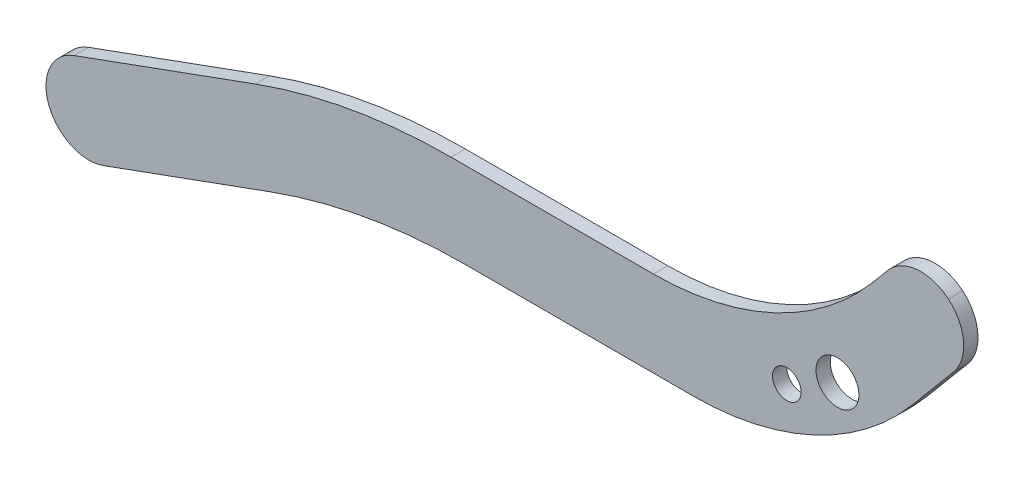
ISO-10303-21;
HEADER;
FILE_DESCRIPTION(('STEP AP214'),'2;1');
FILE_NAME('part.step','',(''),(''),'','','');
FILE_SCHEMA(('AUTOMOTIVE_DESIGN { 1 0 10303 214 1 1 1 1 }'));
ENDSEC;
DATA;
#1=APPLICATION_CONTEXT('core data for automotive mechanical design processes');
#2=APPLICATION_PROTOCOL_DEFINITION('international standard','automotive_design',2000,#1);
#3=PRODUCT_CONTEXT('',#1,'mechanical');
#4=PRODUCT('Part','Part','',(#3));
#5=PRODUCT_RELATED_PRODUCT_CATEGORY('part','',(#4));
#6=PRODUCT_DEFINITION_FORMATION('','',#4);
#7=PRODUCT_DEFINITION_CONTEXT('part definition',#1,'design');
#8=PRODUCT_DEFINITION('design','',#6,#7);
#9=PRODUCT_DEFINITION_SHAPE('','',#8);
#10=(LENGTH_UNIT() NAMED_UNIT(*) SI_UNIT(.MILLI.,.METRE.));
#11=(NAMED_UNIT(*) PLANE_ANGLE_UNIT() SI_UNIT($,.RADIAN.));
#12=(NAMED_UNIT(*) SI_UNIT($,.STERADIAN.) SOLID_ANGLE_UNIT());
#13=UNCERTAINTY_MEASURE_WITH_UNIT(LENGTH_MEASURE(1.E-05),#10,'distance_accuracy_value','');
#14=(GEOMETRIC_REPRESENTATION_CONTEXT(3) GLOBAL_UNCERTAINTY_ASSIGNED_CONTEXT((#13)) GLOBAL_UNIT_ASSIGNED_CONTEXT((#10,
#11,#12)) REPRESENTATION_CONTEXT('',''));
#15=CARTESIAN_POINT('',(0.,0.,0.));
#16=DIRECTION('',(0.,0.,1.));
#17=DIRECTION('',(1.,0.,0.));
#18=AXIS2_PLACEMENT_3D('',#15,#16,#17);
#19=CARTESIAN_POINT('',(-12.4163646161911,34.1136814147011,-5.));
#20=DIRECTION('',(0.342020143325663,-0.93969262078591,0.));
#21=DIRECTION('',(0.93969262078591,0.342020143325663,0.));
#22=AXIS2_PLACEMENT_3D('',#19,#20,#21);
#23=PLANE('',#22);
#24=DIRECTION('',(-0.939692620785911,-0.342020143325663,0.));
#25=VECTOR('',#24,1.);
#26=CARTESIAN_POINT('',(-12.4163646161911,34.1136814147011,0.));
#27=LINE('',#26,#25);
#28=CARTESIAN_POINT('',(-180.493727812813,-27.0614758428179,0.));
#29=VERTEX_POINT('',#28);
#30=CARTESIAN_POINT('',(-238.838959928706,-48.297403644355,0.));
#31=VERTEX_POINT('',#30);
#32=EDGE_CURVE('E175',#29,#31,#27,.T.);
#33=ORIENTED_EDGE('',*,*,#32,.T.);
#34=DIRECTION('',(0.,0.,1.));
#35=VECTOR('',#34,1.);
#36=CARTESIAN_POINT('',(-238.838959928706,-48.297403644355,-5.));
#37=LINE('',#36,#35);
#38=CARTESIAN_POINT('',(-238.838959928706,-48.297403644355,-5.));
#39=VERTEX_POINT('',#38);
#40=EDGE_CURVE('E158',#39,#31,#37,.T.);
#41=ORIENTED_EDGE('',*,*,#40,.F.);
#42=DIRECTION('',(-0.939692620785911,-0.342020143325663,0.));
#43=VECTOR('',#42,1.);
#44=CARTESIAN_POINT('',(-12.4163646161911,34.1136814147011,-5.));
#45=LINE('',#44,#43);
#46=CARTESIAN_POINT('',(-180.493727812813,-27.0614758428179,-5.));
#47=VERTEX_POINT('',#46);
#48=EDGE_CURVE('E144',#47,#39,#45,.T.);
#49=ORIENTED_EDGE('',*,*,#48,.F.);
#50=DIRECTION('',(0.,0.,1.));
#51=VECTOR('',#50,1.);
#52=CARTESIAN_POINT('',(-180.493727812813,-27.0614758428179,-5.));
#53=LINE('',#52,#51);
#54=EDGE_CURVE('E211',#29,#47,#53,.F.);
#55=ORIENTED_EDGE('',*,*,#54,.F.);
#56=EDGE_LOOP('',(#33,#41,#49,#55));
#57=FACE_BOUND('',#56,.T.);
#58=ADVANCED_FACE('F43',(#57),#23,.T.);
#59=CARTESIAN_POINT('',(0.,-15.,-5.));
#60=DIRECTION('',(0.,1.,0.));
#61=DIRECTION('',(-1.,0.,0.));
#62=AXIS2_PLACEMENT_3D('',#59,#60,#61);
#63=PLANE('',#62);
#64=DIRECTION('',(1.,0.,0.));
#65=VECTOR('',#64,1.);
#66=CARTESIAN_POINT('',(0.,-15.,0.));
#67=LINE('',#66,#65);
#68=CARTESIAN_POINT('',(-112.089699147681,-15.,0.));
#69=VERTEX_POINT('',#68);
#70=CARTESIAN_POINT('',(-32.64153607085,-15.,0.));
#71=VERTEX_POINT('',#70);
#72=EDGE_CURVE('E178',#69,#71,#67,.T.);
#73=ORIENTED_EDGE('',*,*,#72,.F.);
#74=DIRECTION('',(0.,0.,1.));
#75=VECTOR('',#74,1.);
#76=CARTESIAN_POINT('',(-112.089699147681,-15.,-5.));
#77=LINE('',#76,#75);
#78=CARTESIAN_POINT('',(-112.089699147681,-15.,-5.));
#79=VERTEX_POINT('',#78);
#80=EDGE_CURVE('E208',#79,#69,#77,.T.);
#81=ORIENTED_EDGE('',*,*,#80,.F.);
#82=DIRECTION('',(1.,0.,0.));
#83=VECTOR('',#82,1.);
#84=CARTESIAN_POINT('',(0.,-15.,-5.));
#85=LINE('',#84,#83);
#86=CARTESIAN_POINT('',(-32.64153607085,-15.,-5.));
#87=VERTEX_POINT('',#86);
#88=EDGE_CURVE('E256',#79,#87,#85,.T.);
#89=ORIENTED_EDGE('',*,*,#88,.T.);
#90=DIRECTION('',(0.,0.,1.));
#91=VECTOR('',#90,1.);
#92=CARTESIAN_POINT('',(-32.64153607085,-15.,-5.));
#93=LINE('',#92,#91);
#94=EDGE_CURVE('E229',#71,#87,#93,.F.);
#95=ORIENTED_EDGE('',*,*,#94,.F.);
#96=EDGE_LOOP('',(#73,#81,#89,#95));
#97=FACE_BOUND('',#96,.T.);
#98=ADVANCED_FACE('F266',(#97),#63,.F.);
#99=CARTESIAN_POINT('',(15.5952751459778,-13.0859896230981,-5.));
#100=DIRECTION('',(-0.76604444311898,0.642787609686537,0.));
#101=DIRECTION('',(-0.642787609686537,-0.76604444311898,0.));
#102=AXIS2_PLACEMENT_3D('',#99,#100,#101);
#103=PLANE('',#102);
#104=DIRECTION('',(0.642787609686537,0.76604444311898,0.));
#105=VECTOR('',#104,1.);
#106=CARTESIAN_POINT('',(15.5952751459778,-13.0859896230981,0.));
#107=LINE('',#106,#105);
#108=CARTESIAN_POINT('',(43.962908241048,20.7212390313463,0.));
#109=VERTEX_POINT('',#108);
#110=CARTESIAN_POINT('',(58.334651826329,37.8488160809478,0.));
#111=VERTEX_POINT('',#110);
#112=EDGE_CURVE('E181',#109,#111,#107,.T.);
#113=ORIENTED_EDGE('',*,*,#112,.F.);
#114=DIRECTION('',(0.,0.,1.));
#115=VECTOR('',#114,1.);
#116=CARTESIAN_POINT('',(43.962908241048,20.7212390313463,-5.));
#117=LINE('',#116,#115);
#118=CARTESIAN_POINT('',(43.962908241048,20.7212390313463,-5.));
#119=VERTEX_POINT('',#118);
#120=EDGE_CURVE('E224',#119,#109,#117,.T.);
#121=ORIENTED_EDGE('',*,*,#120,.F.);
#122=DIRECTION('',(0.642787609686537,0.76604444311898,0.));
#123=VECTOR('',#122,1.);
#124=CARTESIAN_POINT('',(15.5952751459778,-13.0859896230981,-5.));
#125=LINE('',#124,#123);
#126=CARTESIAN_POINT('',(58.334651826329,37.8488160809478,-5.));
#127=VERTEX_POINT('',#126);
#128=EDGE_CURVE('E254',#119,#127,#125,.T.);
#129=ORIENTED_EDGE('',*,*,#128,.T.);
#130=DIRECTION('',(0.,0.,1.));
#131=VECTOR('',#130,1.);
#132=CARTESIAN_POINT('',(58.334651826329,37.8488160809478,-5.));
#133=LINE('',#132,#131);
#134=EDGE_CURVE('E11',#111,#127,#133,.F.);
#135=ORIENTED_EDGE('',*,*,#134,.F.);
#136=EDGE_LOOP('',(#113,#121,#129,#135));
#137=FACE_BOUND('',#136,.T.);
#138=ADVANCED_FACE('F285',(#137),#103,.F.);
#139=CARTESIAN_POINT('',(-7.38605814759156,6.19763866749798,-5.));
#140=DIRECTION('',(-0.76604444311898,0.642787609686537,0.));
#141=DIRECTION('',(-0.642787609686537,-0.76604444311898,0.));
#142=AXIS2_PLACEMENT_3D('',#139,#140,#141);
#143=PLANE('',#142);
#144=DIRECTION('',(0.642787609686537,0.76604444311898,0.));
#145=VECTOR('',#144,1.);
#146=CARTESIAN_POINT('',(-7.38605814759156,6.19763866749798,-5.));
#147=LINE('',#146,#145);
#148=CARTESIAN_POINT('',(29.9736784963977,50.721239031346,-5.));
#149=VERTEX_POINT('',#148);
#150=CARTESIAN_POINT('',(35.3533185327596,57.132444371544,-5.));
#151=VERTEX_POINT('',#150);
#152=EDGE_CURVE('E166',#149,#151,#147,.T.);
#153=ORIENTED_EDGE('',*,*,#152,.F.);
#154=DIRECTION('',(0.,0.,1.));
#155=VECTOR('',#154,1.);
#156=CARTESIAN_POINT('',(29.9736784963977,50.721239031346,-5.));
#157=LINE('',#156,#155);
#158=CARTESIAN_POINT('',(29.9736784963977,50.721239031346,0.));
#159=VERTEX_POINT('',#158);
#160=EDGE_CURVE('E221',#159,#149,#157,.F.);
#161=ORIENTED_EDGE('',*,*,#160,.F.);
#162=DIRECTION('',(0.642787609686537,0.76604444311898,0.));
#163=VECTOR('',#162,1.);
#164=CARTESIAN_POINT('',(-7.38605814759156,6.19763866749798,0.));
#165=LINE('',#164,#163);
#166=CARTESIAN_POINT('',(35.3533185327596,57.132444371544,0.));
#167=VERTEX_POINT('',#166);
#168=EDGE_CURVE('E184',#159,#167,#165,.T.);
#169=ORIENTED_EDGE('',*,*,#168,.T.);
#170=DIRECTION('',(0.,0.,1.));
#171=VECTOR('',#170,1.);
#172=CARTESIAN_POINT('',(35.3533185327596,57.1324443715439,-5.));
#173=LINE('',#172,#171);
#174=EDGE_CURVE('E238',#151,#167,#173,.T.);
#175=ORIENTED_EDGE('',*,*,#174,.F.);
#176=EDGE_LOOP('',(#153,#161,#169,#175));
#177=FACE_BOUND('',#176,.T.);
#178=ADVANCED_FACE('F251',(#177),#143,.T.);
#179=CARTESIAN_POINT('',(0.,14.9999999999996,-5.));
#180=DIRECTION('',(0.,1.,0.));
#181=DIRECTION('',(-1.,0.,0.));
#182=AXIS2_PLACEMENT_3D('',#179,#180,#181);
#183=PLANE('',#182);
#184=DIRECTION('',(1.,0.,0.));
#185=VECTOR('',#184,1.);
#186=CARTESIAN_POINT('',(0.,14.9999999999996,-5.));
#187=LINE('',#186,#185);
#188=CARTESIAN_POINT('',(-117.379508568934,14.9999999999999,-5.));
#189=VERTEX_POINT('',#188);
#190=CARTESIAN_POINT('',(-46.6307658155006,14.9999999999997,-5.));
#191=VERTEX_POINT('',#190);
#192=EDGE_CURVE('E163',#189,#191,#187,.T.);
#193=ORIENTED_EDGE('',*,*,#192,.F.);
#194=DIRECTION('',(0.,0.,1.));
#195=VECTOR('',#194,1.);
#196=CARTESIAN_POINT('',(-117.379508568934,14.9999999999999,-5.));
#197=LINE('',#196,#195);
#198=CARTESIAN_POINT('',(-117.379508568934,14.9999999999999,0.));
#199=VERTEX_POINT('',#198);
#200=EDGE_CURVE('E203',#199,#189,#197,.F.);
#201=ORIENTED_EDGE('',*,*,#200,.F.);
#202=DIRECTION('',(1.,0.,0.));
#203=VECTOR('',#202,1.);
#204=CARTESIAN_POINT('',(0.,14.9999999999996,0.));
#205=LINE('',#204,#203);
#206=CARTESIAN_POINT('',(-46.6307658155006,14.9999999999997,0.));
#207=VERTEX_POINT('',#206);
#208=EDGE_CURVE('E187',#199,#207,#205,.T.);
#209=ORIENTED_EDGE('',*,*,#208,.T.);
#210=DIRECTION('',(0.,0.,1.));
#211=VECTOR('',#210,1.);
#212=CARTESIAN_POINT('',(-46.6307658155006,14.9999999999997,0.));
#213=LINE('',#212,#211);
#214=EDGE_CURVE('E218',#191,#207,#213,.T.);
#215=ORIENTED_EDGE('',*,*,#214,.F.);
#216=EDGE_LOOP('',(#193,#201,#209,#215));
#217=FACE_BOUND('',#216,.T.);
#218=ADVANCED_FACE('F313',(#217),#183,.T.);
#219=CARTESIAN_POINT('',(-22.6769689159616,62.304460038279,-5.));
#220=DIRECTION('',(-0.342020143325668,0.939692620785909,0.));
#221=DIRECTION('',(-0.939692620785909,-0.342020143325668,0.));
#222=AXIS2_PLACEMENT_3D('',#219,#220,#221);
#223=PLANE('',#222);
#224=DIRECTION('',(0.939692620785909,0.342020143325668,0.));
#225=VECTOR('',#224,1.);
#226=CARTESIAN_POINT('',(-22.6769689159616,62.304460038279,-5.));
#227=LINE('',#226,#225);
#228=CARTESIAN_POINT('',(-249.099564228476,-20.1066250207777,-5.));
#229=VERTEX_POINT('',#228);
#230=CARTESIAN_POINT('',(-185.783537234068,2.93852415718159,-5.));
#231=VERTEX_POINT('',#230);
#232=EDGE_CURVE('E142',#229,#231,#227,.T.);
#233=ORIENTED_EDGE('',*,*,#232,.F.);
#234=DIRECTION('',(0.,0.,1.));
#235=VECTOR('',#234,1.);
#236=CARTESIAN_POINT('',(-249.099564228476,-20.1066250207777,-5.));
#237=LINE('',#236,#235);
#238=CARTESIAN_POINT('',(-249.099564228476,-20.1066250207777,0.));
#239=VERTEX_POINT('',#238);
#240=EDGE_CURVE('E151',#229,#239,#237,.T.);
#241=ORIENTED_EDGE('',*,*,#240,.T.);
#242=DIRECTION('',(0.939692620785909,0.342020143325668,0.));
#243=VECTOR('',#242,1.);
#244=CARTESIAN_POINT('',(-22.6769689159616,62.304460038279,0.));
#245=LINE('',#244,#243);
#246=CARTESIAN_POINT('',(-185.783537234068,2.93852415718159,0.));
#247=VERTEX_POINT('',#246);
#248=EDGE_CURVE('E190',#239,#247,#245,.T.);
#249=ORIENTED_EDGE('',*,*,#248,.T.);
#250=DIRECTION('',(0.,0.,1.));
#251=VECTOR('',#250,1.);
#252=CARTESIAN_POINT('',(-185.783537234068,2.93852415718159,-5.));
#253=LINE('',#252,#251);
#254=EDGE_CURVE('E157',#231,#247,#253,.T.);
#255=ORIENTED_EDGE('',*,*,#254,.F.);
#256=EDGE_LOOP('',(#233,#241,#249,#255));
#257=FACE_BOUND('',#256,.T.);
#258=ADVANCED_FACE('F161',(#257),#223,.T.);
#259=CARTESIAN_POINT('',(0.,5.00000000000001,-5.));
#260=DIRECTION('',(0.,0.,1.));
#261=DIRECTION('',(-1.,0.,0.));
#262=AXIS2_PLACEMENT_3D('',#259,#260,#261);
#263=CYLINDRICAL_SURFACE('',#262,5.);
#264=CARTESIAN_POINT('',(0.,5.00000000000001,-5.));
#265=DIRECTION('',(0.,0.,1.));
#266=DIRECTION('',(1.,0.,0.));
#267=AXIS2_PLACEMENT_3D('',#264,#265,#266);
#268=CIRCLE('',#267,5.);
#269=CARTESIAN_POINT('',(5.,5.00000000000001,-5.));
#270=VERTEX_POINT('',#269);
#271=EDGE_CURVE('E148',#270,#270,#268,.T.);
#272=ORIENTED_EDGE('',*,*,#271,.F.);
#273=EDGE_LOOP('',(#272));
#274=FACE_BOUND('',#273,.T.);
#275=CARTESIAN_POINT('',(0.,5.00000000000001,0.));
#276=DIRECTION('',(0.,0.,1.));
#277=DIRECTION('',(1.,0.,0.));
#278=AXIS2_PLACEMENT_3D('',#275,#276,#277);
#279=CIRCLE('',#278,5.);
#280=CARTESIAN_POINT('',(5.,5.00000000000001,0.));
#281=VERTEX_POINT('',#280);
#282=EDGE_CURVE('E193',#281,#281,#279,.T.);
#283=ORIENTED_EDGE('',*,*,#282,.T.);
#284=EDGE_LOOP('',(#283));
#285=FACE_BOUND('',#284,.T.);
#286=ADVANCED_FACE('F320',(#274,#285),#263,.F.);
#287=CARTESIAN_POINT('',(-243.969262078591,-34.2020143325663,-5.));
#288=DIRECTION('',(0.,0.,1.));
#289=DIRECTION('',(-1.,0.,0.));
#290=AXIS2_PLACEMENT_3D('',#287,#288,#289);
#291=CYLINDRICAL_SURFACE('',#290,15.);
#292=CARTESIAN_POINT('',(-243.969262078591,-34.2020143325663,0.));
#293=DIRECTION('',(0.,0.,1.));
#294=DIRECTION('',(1.,0.,0.));
#295=AXIS2_PLACEMENT_3D('',#292,#293,#294);
#296=CIRCLE('',#295,15.);
#297=EDGE_CURVE('E153',#239,#31,#296,.T.);
#298=ORIENTED_EDGE('',*,*,#297,.F.);
#299=ORIENTED_EDGE('',*,*,#240,.F.);
#300=CARTESIAN_POINT('',(-243.969262078591,-34.2020143325663,-5.));
#301=DIRECTION('',(0.,0.,1.));
#302=DIRECTION('',(1.,0.,0.));
#303=AXIS2_PLACEMENT_3D('',#300,#301,#302);
#304=CIRCLE('',#303,15.);
#305=EDGE_CURVE('E137',#229,#39,#304,.T.);
#306=ORIENTED_EDGE('',*,*,#305,.T.);
#307=ORIENTED_EDGE('',*,*,#40,.T.);
#308=EDGE_LOOP('',(#298,#299,#306,#307));
#309=FACE_BOUND('',#308,.T.);
#310=ADVANCED_FACE('F152',(#309),#291,.T.);
#311=CARTESIAN_POINT('',(17.69932590537,14.3131016581748,-5.));
#312=DIRECTION('',(0.,0.,1.));
#313=DIRECTION('',(-1.,0.,0.));
#314=AXIS2_PLACEMENT_3D('',#311,#312,#313);
#315=CYLINDRICAL_SURFACE('',#314,7.5);
#316=CARTESIAN_POINT('',(17.69932590537,14.3131016581748,-5.));
#317=DIRECTION('',(0.,0.,1.));
#318=DIRECTION('',(1.,0.,0.));
#319=AXIS2_PLACEMENT_3D('',#316,#317,#318);
#320=CIRCLE('',#319,7.5);
#321=CARTESIAN_POINT('',(25.19932590537,14.3131016581748,-5.));
#322=VERTEX_POINT('',#321);
#323=EDGE_CURVE('E172',#322,#322,#320,.T.);
#324=ORIENTED_EDGE('',*,*,#323,.F.);
#325=EDGE_LOOP('',(#324));
#326=FACE_BOUND('',#325,.T.);
#327=CARTESIAN_POINT('',(17.69932590537,14.3131016581748,0.));
#328=DIRECTION('',(0.,0.,1.));
#329=DIRECTION('',(1.,0.,0.));
#330=AXIS2_PLACEMENT_3D('',#327,#328,#329);
#331=CIRCLE('',#330,7.5);
#332=CARTESIAN_POINT('',(25.19932590537,14.3131016581748,0.));
#333=VERTEX_POINT('',#332);
#334=EDGE_CURVE('E196',#333,#333,#331,.T.);
#335=ORIENTED_EDGE('',*,*,#334,.T.);
#336=EDGE_LOOP('',(#335));
#337=FACE_BOUND('',#336,.T.);
#338=ADVANCED_FACE('F366',(#326,#337),#315,.F.);
#339=CARTESIAN_POINT('',(0.,0.,-5.));
#340=DIRECTION('',(0.,0.,-1.));
#341=DIRECTION('',(1.,0.,0.));
#342=AXIS2_PLACEMENT_3D('',#339,#340,#341);
#343=PLANE('',#342);
#344=CARTESIAN_POINT('',(46.8439851795443,47.4906302262459,-5.));
#345=DIRECTION('',(0.,0.,1.));
#346=DIRECTION('',(1.,0.,0.));
#347=AXIS2_PLACEMENT_3D('',#344,#345,#346);
#348=CIRCLE('',#347,15.);
#349=CARTESIAN_POINT('',(56.4857993248423,58.9812968730306,-5.));
#350=VERTEX_POINT('',#349);
#351=EDGE_CURVE('E65',#127,#350,#348,.T.);
#352=ORIENTED_EDGE('',*,*,#351,.F.);
#353=ORIENTED_EDGE('',*,*,#128,.F.);
#354=CARTESIAN_POINT('',(-32.64153607085,85.,-5.));
#355=DIRECTION('',(0.,0.,1.));
#356=DIRECTION('',(1.,0.,0.));
#357=AXIS2_PLACEMENT_3D('',#354,#355,#356);
#358=CIRCLE('',#357,100.);
#359=EDGE_CURVE('E232',#87,#119,#358,.T.);
#360=ORIENTED_EDGE('',*,*,#359,.F.);
#361=ORIENTED_EDGE('',*,*,#88,.F.);
#362=CARTESIAN_POINT('',(-112.089699147681,-215.,-5.));
#363=DIRECTION('',(0.,0.,1.));
#364=DIRECTION('',(1.,0.,0.));
#365=AXIS2_PLACEMENT_3D('',#362,#363,#364);
#366=CIRCLE('',#365,200.);
#367=EDGE_CURVE('E216',#47,#79,#366,.F.);
#368=ORIENTED_EDGE('',*,*,#367,.F.);
#369=ORIENTED_EDGE('',*,*,#48,.T.);
#370=ORIENTED_EDGE('',*,*,#305,.F.);
#371=ORIENTED_EDGE('',*,*,#232,.T.);
#372=CARTESIAN_POINT('',(-117.379508568934,-185.,-5.));
#373=DIRECTION('',(0.,0.,1.));
#374=DIRECTION('',(1.,0.,0.));
#375=AXIS2_PLACEMENT_3D('',#372,#373,#374);
#376=CIRCLE('',#375,200.);
#377=EDGE_CURVE('E206',#189,#231,#376,.T.);
#378=ORIENTED_EDGE('',*,*,#377,.F.);
#379=ORIENTED_EDGE('',*,*,#192,.T.);
#380=CARTESIAN_POINT('',(-46.6307658155003,115.,-5.));
#381=DIRECTION('',(0.,0.,1.));
#382=DIRECTION('',(1.,0.,0.));
#383=AXIS2_PLACEMENT_3D('',#380,#381,#382);
#384=CIRCLE('',#383,100.);
#385=EDGE_CURVE('E236',#149,#191,#384,.F.);
#386=ORIENTED_EDGE('',*,*,#385,.F.);
#387=ORIENTED_EDGE('',*,*,#152,.T.);
#388=CARTESIAN_POINT('',(46.8439851795443,47.4906302262459,-5.));
#389=DIRECTION('',(0.,0.,1.));
#390=DIRECTION('',(1.,0.,0.));
#391=AXIS2_PLACEMENT_3D('',#388,#389,#390);
#392=CIRCLE('',#391,15.);
#393=EDGE_CURVE('E52',#350,#151,#392,.T.);
#394=ORIENTED_EDGE('',*,*,#393,.F.);
#395=EDGE_LOOP('',(#352,#353,#360,#361,#368,#369,#370,#371,#378,#379,#386,#387,#394));
#396=FACE_BOUND('',#395,.T.);
#397=ORIENTED_EDGE('',*,*,#271,.T.);
#398=EDGE_LOOP('',(#397));
#399=FACE_BOUND('',#398,.T.);
#400=ORIENTED_EDGE('',*,*,#323,.T.);
#401=EDGE_LOOP('',(#400));
#402=FACE_BOUND('',#401,.T.);
#403=ADVANCED_FACE('F139',(#396,#399,#402),#343,.T.);
#404=CARTESIAN_POINT('',(0.,0.,0.));
#405=DIRECTION('',(0.,0.,-1.));
#406=DIRECTION('',(1.,0.,0.));
#407=AXIS2_PLACEMENT_3D('',#404,#405,#406);
#408=PLANE('',#407);
#409=ORIENTED_EDGE('',*,*,#168,.F.);
#410=CARTESIAN_POINT('',(-46.6307658155003,115.,0.));
#411=DIRECTION('',(0.,0.,1.));
#412=DIRECTION('',(1.,0.,0.));
#413=AXIS2_PLACEMENT_3D('',#410,#411,#412);
#414=CIRCLE('',#413,100.);
#415=EDGE_CURVE('E234',#207,#159,#414,.T.);
#416=ORIENTED_EDGE('',*,*,#415,.F.);
#417=ORIENTED_EDGE('',*,*,#208,.F.);
#418=CARTESIAN_POINT('',(-117.379508568934,-185.,0.));
#419=DIRECTION('',(0.,0.,1.));
#420=DIRECTION('',(1.,0.,0.));
#421=AXIS2_PLACEMENT_3D('',#418,#419,#420);
#422=CIRCLE('',#421,200.);
#423=EDGE_CURVE('E201',#247,#199,#422,.F.);
#424=ORIENTED_EDGE('',*,*,#423,.F.);
#425=ORIENTED_EDGE('',*,*,#248,.F.);
#426=ORIENTED_EDGE('',*,*,#297,.T.);
#427=ORIENTED_EDGE('',*,*,#32,.F.);
#428=CARTESIAN_POINT('',(-112.089699147681,-215.,0.));
#429=DIRECTION('',(0.,0.,1.));
#430=DIRECTION('',(1.,0.,0.));
#431=AXIS2_PLACEMENT_3D('',#428,#429,#430);
#432=CIRCLE('',#431,200.);
#433=EDGE_CURVE('E214',#69,#29,#432,.T.);
#434=ORIENTED_EDGE('',*,*,#433,.F.);
#435=ORIENTED_EDGE('',*,*,#72,.T.);
#436=CARTESIAN_POINT('',(-32.64153607085,85.,0.));
#437=DIRECTION('',(0.,0.,1.));
#438=DIRECTION('',(1.,0.,0.));
#439=AXIS2_PLACEMENT_3D('',#436,#437,#438);
#440=CIRCLE('',#439,100.);
#441=EDGE_CURVE('E227',#109,#71,#440,.F.);
#442=ORIENTED_EDGE('',*,*,#441,.F.);
#443=ORIENTED_EDGE('',*,*,#112,.T.);
#444=CARTESIAN_POINT('',(46.8439851795443,47.4906302262459,0.));
#445=DIRECTION('',(0.,0.,1.));
#446=DIRECTION('',(1.,0.,0.));
#447=AXIS2_PLACEMENT_3D('',#444,#445,#446);
#448=CIRCLE('',#447,15.);
#449=CARTESIAN_POINT('',(56.4857993248423,58.9812968730306,0.));
#450=VERTEX_POINT('',#449);
#451=EDGE_CURVE('E241',#450,#111,#448,.F.);
#452=ORIENTED_EDGE('',*,*,#451,.F.);
#453=CARTESIAN_POINT('',(46.8439851795443,47.4906302262459,0.));
#454=DIRECTION('',(0.,0.,1.));
#455=DIRECTION('',(1.,0.,0.));
#456=AXIS2_PLACEMENT_3D('',#453,#454,#455);
#457=CIRCLE('',#456,15.);
#458=EDGE_CURVE('E243',#167,#450,#457,.F.);
#459=ORIENTED_EDGE('',*,*,#458,.F.);
#460=EDGE_LOOP('',(#409,#416,#417,#424,#425,#426,#427,#434,#435,#442,#443,#452,#459));
#461=FACE_BOUND('',#460,.T.);
#462=ORIENTED_EDGE('',*,*,#282,.F.);
#463=EDGE_LOOP('',(#462));
#464=FACE_BOUND('',#463,.T.);
#465=ORIENTED_EDGE('',*,*,#334,.F.);
#466=EDGE_LOOP('',(#465));
#467=FACE_BOUND('',#466,.T.);
#468=ADVANCED_FACE('F272',(#461,#464,#467),#408,.F.);
#469=CARTESIAN_POINT('',(-117.379508568934,-185.,-5.));
#470=DIRECTION('',(0.,0.,1.));
#471=DIRECTION('',(-1.,0.,0.));
#472=AXIS2_PLACEMENT_3D('',#469,#470,#471);
#473=CYLINDRICAL_SURFACE('',#472,200.);
#474=ORIENTED_EDGE('',*,*,#377,.T.);
#475=ORIENTED_EDGE('',*,*,#254,.T.);
#476=ORIENTED_EDGE('',*,*,#423,.T.);
#477=ORIENTED_EDGE('',*,*,#200,.T.);
#478=EDGE_LOOP('',(#474,#475,#476,#477));
#479=FACE_BOUND('',#478,.T.);
#480=ADVANCED_FACE('F289',(#479),#473,.T.);
#481=CARTESIAN_POINT('',(-112.089699147681,-215.,-5.));
#482=DIRECTION('',(0.,0.,1.));
#483=DIRECTION('',(-1.,0.,0.));
#484=AXIS2_PLACEMENT_3D('',#481,#482,#483);
#485=CYLINDRICAL_SURFACE('',#484,200.);
#486=ORIENTED_EDGE('',*,*,#367,.T.);
#487=ORIENTED_EDGE('',*,*,#80,.T.);
#488=ORIENTED_EDGE('',*,*,#433,.T.);
#489=ORIENTED_EDGE('',*,*,#54,.T.);
#490=EDGE_LOOP('',(#486,#487,#488,#489));
#491=FACE_BOUND('',#490,.T.);
#492=ADVANCED_FACE('F278',(#491),#485,.F.);
#493=CARTESIAN_POINT('',(-46.6307658155003,115.,-5.));
#494=DIRECTION('',(0.,0.,-1.));
#495=DIRECTION('',(1.,0.,0.));
#496=AXIS2_PLACEMENT_3D('',#493,#494,#495);
#497=CYLINDRICAL_SURFACE('',#496,100.);
#498=ORIENTED_EDGE('',*,*,#385,.T.);
#499=ORIENTED_EDGE('',*,*,#214,.T.);
#500=ORIENTED_EDGE('',*,*,#415,.T.);
#501=ORIENTED_EDGE('',*,*,#160,.T.);
#502=EDGE_LOOP('',(#498,#499,#500,#501));
#503=FACE_BOUND('',#502,.T.);
#504=ADVANCED_FACE('F295',(#503),#497,.F.);
#505=CARTESIAN_POINT('',(-32.64153607085,85.,-5.));
#506=DIRECTION('',(0.,0.,1.));
#507=DIRECTION('',(-1.,0.,0.));
#508=AXIS2_PLACEMENT_3D('',#505,#506,#507);
#509=CYLINDRICAL_SURFACE('',#508,100.);
#510=ORIENTED_EDGE('',*,*,#359,.T.);
#511=ORIENTED_EDGE('',*,*,#120,.T.);
#512=ORIENTED_EDGE('',*,*,#441,.T.);
#513=ORIENTED_EDGE('',*,*,#94,.T.);
#514=EDGE_LOOP('',(#510,#511,#512,#513));
#515=FACE_BOUND('',#514,.T.);
#516=ADVANCED_FACE('F269',(#515),#509,.T.);
#517=CARTESIAN_POINT('',(46.8439851795443,47.4906302262459,-5.));
#518=DIRECTION('',(0.,0.,-1.));
#519=DIRECTION('',(1.,0.,0.));
#520=AXIS2_PLACEMENT_3D('',#517,#518,#519);
#521=CYLINDRICAL_SURFACE('',#520,15.);
#522=DIRECTION('',(0.,0.,1.));
#523=VECTOR('',#522,1.);
#524=CARTESIAN_POINT('',(56.4857993248423,58.9812968730306,0.));
#525=LINE('',#524,#523);
#526=EDGE_CURVE('E47',#350,#450,#525,.T.);
#527=ORIENTED_EDGE('',*,*,#526,.T.);
#528=ORIENTED_EDGE('',*,*,#451,.T.);
#529=ORIENTED_EDGE('',*,*,#134,.T.);
#530=ORIENTED_EDGE('',*,*,#351,.T.);
#531=EDGE_LOOP('',(#527,#528,#529,#530));
#532=FACE_BOUND('',#531,.T.);
#533=ADVANCED_FACE('F45',(#532),#521,.T.);
#534=CARTESIAN_POINT('',(46.8439851795443,47.4906302262459,-5.));
#535=DIRECTION('',(0.,0.,1.));
#536=DIRECTION('',(-1.,0.,0.));
#537=AXIS2_PLACEMENT_3D('',#534,#535,#536);
#538=CYLINDRICAL_SURFACE('',#537,15.);
#539=ORIENTED_EDGE('',*,*,#393,.T.);
#540=ORIENTED_EDGE('',*,*,#174,.T.);
#541=ORIENTED_EDGE('',*,*,#458,.T.);
#542=ORIENTED_EDGE('',*,*,#526,.F.);
#543=EDGE_LOOP('',(#539,#540,#541,#542));
#544=FACE_BOUND('',#543,.T.);
#545=ADVANCED_FACE('F247',(#544),#538,.T.);
#546=CLOSED_SHELL('',(#58,#98,#138,#178,#218,#258,#286,#310,#338,#403,#468,#480,#492,#504,#516,
#533,#545));
#547=MANIFOLD_SOLID_BREP('B2',#546);
#548=ADVANCED_BREP_SHAPE_REPRESENTATION('',(#18,#547),#14);
#549=SHAPE_DEFINITION_REPRESENTATION(#9,#548);
ENDSEC;
END-ISO-10303-21;
